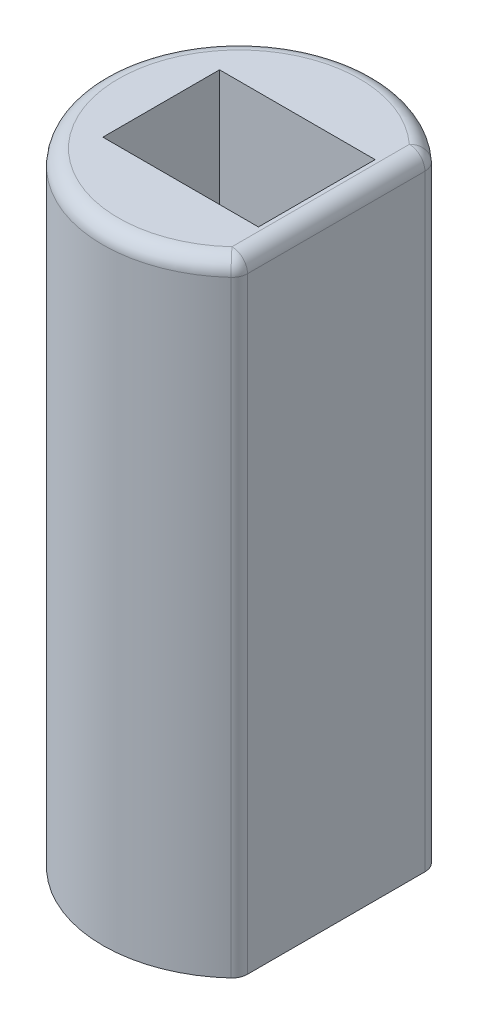
ISO-10303-21;
HEADER;
FILE_DESCRIPTION(('STEP AP214'),'2;1');
FILE_NAME('part.step','',(''),(''),'','','');
FILE_SCHEMA(('AUTOMOTIVE_DESIGN { 1 0 10303 214 1 1 1 1 }'));
ENDSEC;
DATA;
#1=APPLICATION_CONTEXT('core data for automotive mechanical design processes');
#2=APPLICATION_PROTOCOL_DEFINITION('international standard','automotive_design',2000,#1);
#3=PRODUCT_CONTEXT('',#1,'mechanical');
#4=PRODUCT('Part','Part','',(#3));
#5=PRODUCT_RELATED_PRODUCT_CATEGORY('part','',(#4));
#6=PRODUCT_DEFINITION_FORMATION('','',#4);
#7=PRODUCT_DEFINITION_CONTEXT('part definition',#1,'design');
#8=PRODUCT_DEFINITION('design','',#6,#7);
#9=PRODUCT_DEFINITION_SHAPE('','',#8);
#10=(LENGTH_UNIT() NAMED_UNIT(*) SI_UNIT(.MILLI.,.METRE.));
#11=(NAMED_UNIT(*) PLANE_ANGLE_UNIT() SI_UNIT($,.RADIAN.));
#12=(NAMED_UNIT(*) SI_UNIT($,.STERADIAN.) SOLID_ANGLE_UNIT());
#13=UNCERTAINTY_MEASURE_WITH_UNIT(LENGTH_MEASURE(1.E-05),#10,'distance_accuracy_value','');
#14=(GEOMETRIC_REPRESENTATION_CONTEXT(3) GLOBAL_UNCERTAINTY_ASSIGNED_CONTEXT((#13)) GLOBAL_UNIT_ASSIGNED_CONTEXT((#10,
#11,#12)) REPRESENTATION_CONTEXT('',''));
#15=CARTESIAN_POINT('',(0.,0.,0.));
#16=DIRECTION('',(0.,0.,1.));
#17=DIRECTION('',(1.,0.,0.));
#18=AXIS2_PLACEMENT_3D('',#15,#16,#17);
#19=CARTESIAN_POINT('',(12.7,101.6,0.));
#20=DIRECTION('',(-1.,0.,0.));
#21=DIRECTION('',(0.,0.,1.));
#22=AXIS2_PLACEMENT_3D('',#19,#20,#21);
#23=PLANE('',#22);
#24=DIRECTION('',(0.,-1.,0.));
#25=VECTOR('',#24,1.);
#26=CARTESIAN_POINT('',(12.7,101.6,-9.525));
#27=LINE('',#26,#25);
#28=CARTESIAN_POINT('',(12.7,101.6,-9.525));
#29=VERTEX_POINT('',#28);
#30=CARTESIAN_POINT('',(12.7,63.5,-9.525));
#31=VERTEX_POINT('',#30);
#32=EDGE_CURVE('E178',#29,#31,#27,.T.);
#33=ORIENTED_EDGE('',*,*,#32,.T.);
#34=DIRECTION('',(0.,0.,1.));
#35=VECTOR('',#34,1.);
#36=CARTESIAN_POINT('',(12.7,63.5,0.));
#37=LINE('',#36,#35);
#38=CARTESIAN_POINT('',(12.7,63.5,9.525));
#39=VERTEX_POINT('',#38);
#40=EDGE_CURVE('E157',#31,#39,#37,.T.);
#41=ORIENTED_EDGE('',*,*,#40,.T.);
#42=DIRECTION('',(0.,-1.,0.));
#43=VECTOR('',#42,1.);
#44=CARTESIAN_POINT('',(12.7,101.6,9.525));
#45=LINE('',#44,#43);
#46=CARTESIAN_POINT('',(12.7,101.6,9.525));
#47=VERTEX_POINT('',#46);
#48=EDGE_CURVE('E136',#47,#39,#45,.T.);
#49=ORIENTED_EDGE('',*,*,#48,.F.);
#50=DIRECTION('',(0.,0.,-1.));
#51=VECTOR('',#50,1.);
#52=CARTESIAN_POINT('',(12.7,101.6,0.));
#53=LINE('',#52,#51);
#54=EDGE_CURVE('E187',#47,#29,#53,.T.);
#55=ORIENTED_EDGE('',*,*,#54,.T.);
#56=EDGE_LOOP('',(#33,#41,#49,#55));
#57=FACE_BOUND('',#56,.T.);
#58=ADVANCED_FACE('F34',(#57),#23,.T.);
#59=CARTESIAN_POINT('',(-12.7,101.6,0.));
#60=DIRECTION('',(1.,0.,0.));
#61=DIRECTION('',(0.,0.,-1.));
#62=AXIS2_PLACEMENT_3D('',#59,#60,#61);
#63=PLANE('',#62);
#64=DIRECTION('',(0.,-1.,0.));
#65=VECTOR('',#64,1.);
#66=CARTESIAN_POINT('',(-12.7,101.6,9.525));
#67=LINE('',#66,#65);
#68=CARTESIAN_POINT('',(-12.7,101.6,9.525));
#69=VERTEX_POINT('',#68);
#70=CARTESIAN_POINT('',(-12.7,25.4,9.525));
#71=VERTEX_POINT('',#70);
#72=EDGE_CURVE('E170',#69,#71,#67,.T.);
#73=ORIENTED_EDGE('',*,*,#72,.T.);
#74=DIRECTION('',(0.,0.,1.));
#75=VECTOR('',#74,1.);
#76=CARTESIAN_POINT('',(-12.7,25.4,0.));
#77=LINE('',#76,#75);
#78=CARTESIAN_POINT('',(-12.7,25.4,-9.525));
#79=VERTEX_POINT('',#78);
#80=EDGE_CURVE('E197',#79,#71,#77,.T.);
#81=ORIENTED_EDGE('',*,*,#80,.F.);
#82=DIRECTION('',(0.,-1.,0.));
#83=VECTOR('',#82,1.);
#84=CARTESIAN_POINT('',(-12.7,101.6,-9.525));
#85=LINE('',#84,#83);
#86=CARTESIAN_POINT('',(-12.7,101.6,-9.525));
#87=VERTEX_POINT('',#86);
#88=EDGE_CURVE('E181',#87,#79,#85,.T.);
#89=ORIENTED_EDGE('',*,*,#88,.F.);
#90=DIRECTION('',(0.,0.,1.));
#91=VECTOR('',#90,1.);
#92=CARTESIAN_POINT('',(-12.7,101.6,0.));
#93=LINE('',#92,#91);
#94=EDGE_CURVE('E185',#87,#69,#93,.T.);
#95=ORIENTED_EDGE('',*,*,#94,.T.);
#96=EDGE_LOOP('',(#73,#81,#89,#95));
#97=FACE_BOUND('',#96,.T.);
#98=ADVANCED_FACE('F288',(#97),#63,.T.);
#99=DIRECTION('',(0.,0.,1.));
#100=VECTOR('',#99,1.);
#101=CARTESIAN_POINT('',(12.7,60.96,0.));
#102=LINE('',#101,#100);
#103=CARTESIAN_POINT('',(12.7,60.96,-9.525));
#104=VERTEX_POINT('',#103);
#105=CARTESIAN_POINT('',(12.7,60.96,9.525));
#106=VERTEX_POINT('',#105);
#107=EDGE_CURVE('E163',#104,#106,#102,.T.);
#108=ORIENTED_EDGE('',*,*,#107,.F.);
#109=CARTESIAN_POINT('',(12.7,25.4,-9.525));
#110=VERTEX_POINT('',#109);
#111=EDGE_CURVE('E177',#104,#110,#27,.T.);
#112=ORIENTED_EDGE('',*,*,#111,.T.);
#113=DIRECTION('',(0.,0.,-1.));
#114=VECTOR('',#113,1.);
#115=CARTESIAN_POINT('',(12.7,25.4,0.));
#116=LINE('',#115,#114);
#117=CARTESIAN_POINT('',(12.7,25.4,9.525));
#118=VERTEX_POINT('',#117);
#119=EDGE_CURVE('E203',#118,#110,#116,.T.);
#120=ORIENTED_EDGE('',*,*,#119,.F.);
#121=EDGE_CURVE('E172',#106,#118,#45,.T.);
#122=ORIENTED_EDGE('',*,*,#121,.F.);
#123=EDGE_LOOP('',(#108,#112,#120,#122));
#124=FACE_BOUND('',#123,.T.);
#125=ADVANCED_FACE('F291',(#124),#23,.T.);
#126=CARTESIAN_POINT('',(0.,25.4,0.));
#127=DIRECTION('',(0.,-1.,0.));
#128=DIRECTION('',(0.,0.,-1.));
#129=AXIS2_PLACEMENT_3D('',#126,#127,#128);
#130=CYLINDRICAL_SURFACE('',#129,8.73125);
#131=CARTESIAN_POINT('',(0.,25.4,0.));
#132=DIRECTION('',(0.,1.,0.));
#133=DIRECTION('',(0.,0.,1.));
#134=AXIS2_PLACEMENT_3D('',#131,#132,#133);
#135=CIRCLE('',#134,8.73125);
#136=CARTESIAN_POINT('',(0.,25.4,8.73125));
#137=VERTEX_POINT('',#136);
#138=EDGE_CURVE('E194',#137,#137,#135,.T.);
#139=ORIENTED_EDGE('',*,*,#138,.T.);
#140=EDGE_LOOP('',(#139));
#141=FACE_BOUND('',#140,.T.);
#142=CARTESIAN_POINT('',(0.,0.,0.));
#143=DIRECTION('',(0.,1.,0.));
#144=DIRECTION('',(0.,0.,1.));
#145=AXIS2_PLACEMENT_3D('',#142,#143,#144);
#146=CIRCLE('',#145,8.73125);
#147=CARTESIAN_POINT('',(0.,0.,8.73125));
#148=VERTEX_POINT('',#147);
#149=EDGE_CURVE('E190',#148,#148,#146,.T.);
#150=ORIENTED_EDGE('',*,*,#149,.F.);
#151=EDGE_LOOP('',(#150));
#152=FACE_BOUND('',#151,.T.);
#153=ADVANCED_FACE('F283',(#141,#152),#130,.F.);
#154=CARTESIAN_POINT('',(0.,25.4,0.));
#155=DIRECTION('',(0.,1.,0.));
#156=DIRECTION('',(0.,0.,1.));
#157=AXIS2_PLACEMENT_3D('',#154,#155,#156);
#158=PLANE('',#157);
#159=ORIENTED_EDGE('',*,*,#138,.F.);
#160=EDGE_LOOP('',(#159));
#161=FACE_BOUND('',#160,.T.);
#162=ORIENTED_EDGE('',*,*,#80,.T.);
#163=DIRECTION('',(1.,0.,0.));
#164=VECTOR('',#163,1.);
#165=CARTESIAN_POINT('',(0.,25.4,9.525));
#166=LINE('',#165,#164);
#167=EDGE_CURVE('E200',#71,#118,#166,.T.);
#168=ORIENTED_EDGE('',*,*,#167,.T.);
#169=ORIENTED_EDGE('',*,*,#119,.T.);
#170=DIRECTION('',(1.,0.,0.));
#171=VECTOR('',#170,1.);
#172=CARTESIAN_POINT('',(0.,25.4,-9.525));
#173=LINE('',#172,#171);
#174=EDGE_CURVE('E150',#79,#110,#173,.T.);
#175=ORIENTED_EDGE('',*,*,#174,.F.);
#176=EDGE_LOOP('',(#162,#168,#169,#175));
#177=FACE_BOUND('',#176,.T.);
#178=ADVANCED_FACE('F275',(#161,#177),#158,.T.);
#179=CARTESIAN_POINT('',(0.,0.,0.));
#180=DIRECTION('',(0.,1.,0.));
#181=DIRECTION('',(0.,0.,1.));
#182=AXIS2_PLACEMENT_3D('',#179,#180,#181);
#183=PLANE('',#182);
#184=ORIENTED_EDGE('',*,*,#149,.T.);
#185=EDGE_LOOP('',(#184));
#186=FACE_BOUND('',#185,.T.);
#187=CARTESIAN_POINT('',(0.,0.,0.));
#188=DIRECTION('',(0.,1.,0.));
#189=DIRECTION('',(0.,0.,1.));
#190=AXIS2_PLACEMENT_3D('',#187,#188,#189);
#191=CIRCLE('',#190,22.225);
#192=CARTESIAN_POINT('',(15.0556451612903,0.,-16.3486444018247));
#193=VERTEX_POINT('',#192);
#194=CARTESIAN_POINT('',(15.0556451612903,0.,16.3486444018247));
#195=VERTEX_POINT('',#194);
#196=EDGE_CURVE('E188',#193,#195,#191,.T.);
#197=ORIENTED_EDGE('',*,*,#196,.F.);
#198=CARTESIAN_POINT('',(13.335,0.,-14.4802278987591));
#199=DIRECTION('',(0.,1.,0.));
#200=DIRECTION('',(0.,0.,1.));
#201=AXIS2_PLACEMENT_3D('',#198,#199,#200);
#202=CIRCLE('',#201,2.54);
#203=CARTESIAN_POINT('',(15.875,0.,-14.4802278987591));
#204=VERTEX_POINT('',#203);
#205=EDGE_CURVE('E11',#193,#204,#202,.F.);
#206=ORIENTED_EDGE('',*,*,#205,.T.);
#207=DIRECTION('',(0.,0.,1.));
#208=VECTOR('',#207,1.);
#209=CARTESIAN_POINT('',(15.875,0.,0.));
#210=LINE('',#209,#208);
#211=CARTESIAN_POINT('',(15.875,0.,14.4802278987591));
#212=VERTEX_POINT('',#211);
#213=EDGE_CURVE('E184',#204,#212,#210,.T.);
#214=ORIENTED_EDGE('',*,*,#213,.T.);
#215=CARTESIAN_POINT('',(13.335,0.,14.4802278987591));
#216=DIRECTION('',(0.,1.,0.));
#217=DIRECTION('',(0.,0.,1.));
#218=AXIS2_PLACEMENT_3D('',#215,#216,#217);
#219=CIRCLE('',#218,2.54);
#220=EDGE_CURVE('E43',#212,#195,#219,.F.);
#221=ORIENTED_EDGE('',*,*,#220,.T.);
#222=EDGE_LOOP('',(#197,#206,#214,#221));
#223=FACE_BOUND('',#222,.T.);
#224=ADVANCED_FACE('F273',(#186,#223),#183,.F.);
#225=CARTESIAN_POINT('',(15.875,101.6,0.));
#226=DIRECTION('',(1.,0.,0.));
#227=DIRECTION('',(0.,0.,-1.));
#228=AXIS2_PLACEMENT_3D('',#225,#226,#227);
#229=PLANE('',#228);
#230=ORIENTED_EDGE('',*,*,#213,.F.);
#231=DIRECTION('',(0.,1.,0.));
#232=VECTOR('',#231,1.);
#233=CARTESIAN_POINT('',(15.875,101.6,-14.4802278987591));
#234=LINE('',#233,#232);
#235=CARTESIAN_POINT('',(15.875,99.06,-14.4802278987591));
#236=VERTEX_POINT('',#235);
#237=EDGE_CURVE('E216',#204,#236,#234,.T.);
#238=ORIENTED_EDGE('',*,*,#237,.T.);
#239=DIRECTION('',(0.,0.,1.));
#240=VECTOR('',#239,1.);
#241=CARTESIAN_POINT('',(15.875,99.06,0.));
#242=LINE('',#241,#240);
#243=CARTESIAN_POINT('',(15.875,99.06,14.4802278987591));
#244=VERTEX_POINT('',#243);
#245=EDGE_CURVE('E213',#236,#244,#242,.T.);
#246=ORIENTED_EDGE('',*,*,#245,.T.);
#247=DIRECTION('',(0.,1.,0.));
#248=VECTOR('',#247,1.);
#249=CARTESIAN_POINT('',(15.875,0.,14.4802278987591));
#250=LINE('',#249,#248);
#251=EDGE_CURVE('E211',#244,#212,#250,.F.);
#252=ORIENTED_EDGE('',*,*,#251,.T.);
#253=EDGE_LOOP('',(#230,#238,#246,#252));
#254=FACE_BOUND('',#253,.T.);
#255=ADVANCED_FACE('F266',(#254),#229,.T.);
#256=CARTESIAN_POINT('',(0.,101.6,0.));
#257=DIRECTION('',(0.,-1.,0.));
#258=DIRECTION('',(0.,0.,-1.));
#259=AXIS2_PLACEMENT_3D('',#256,#257,#258);
#260=CYLINDRICAL_SURFACE('',#259,22.225);
#261=CARTESIAN_POINT('',(0.,99.06,0.));
#262=DIRECTION('',(0.,1.,0.));
#263=DIRECTION('',(0.,0.,1.));
#264=AXIS2_PLACEMENT_3D('',#261,#262,#263);
#265=CIRCLE('',#264,22.225);
#266=CARTESIAN_POINT('',(15.0556451612903,99.06,16.3486444018247));
#267=VERTEX_POINT('',#266);
#268=CARTESIAN_POINT('',(15.0556451612903,99.06,-16.3486444018247));
#269=VERTEX_POINT('',#268);
#270=EDGE_CURVE('E51',#267,#269,#265,.F.);
#271=ORIENTED_EDGE('',*,*,#270,.T.);
#272=DIRECTION('',(0.,-1.,0.));
#273=VECTOR('',#272,1.);
#274=CARTESIAN_POINT('',(15.0556451612903,101.6,-16.3486444018247));
#275=LINE('',#274,#273);
#276=EDGE_CURVE('E225',#269,#193,#275,.T.);
#277=ORIENTED_EDGE('',*,*,#276,.T.);
#278=ORIENTED_EDGE('',*,*,#196,.T.);
#279=DIRECTION('',(0.,-1.,0.));
#280=VECTOR('',#279,1.);
#281=CARTESIAN_POINT('',(15.0556451612903,101.6,16.3486444018247));
#282=LINE('',#281,#280);
#283=EDGE_CURVE('E56',#195,#267,#282,.F.);
#284=ORIENTED_EDGE('',*,*,#283,.T.);
#285=EDGE_LOOP('',(#271,#277,#278,#284));
#286=FACE_BOUND('',#285,.T.);
#287=ADVANCED_FACE('F271',(#286),#260,.T.);
#288=CARTESIAN_POINT('',(0.,101.6,0.));
#289=DIRECTION('',(0.,1.,0.));
#290=DIRECTION('',(0.,0.,1.));
#291=AXIS2_PLACEMENT_3D('',#288,#289,#290);
#292=PLANE('',#291);
#293=CARTESIAN_POINT('',(0.,101.6,0.));
#294=DIRECTION('',(0.,1.,0.));
#295=DIRECTION('',(0.,0.,1.));
#296=AXIS2_PLACEMENT_3D('',#293,#294,#295);
#297=CIRCLE('',#296,19.685);
#298=CARTESIAN_POINT('',(13.335,101.6,-14.4802278987591));
#299=VERTEX_POINT('',#298);
#300=CARTESIAN_POINT('',(13.335,101.6,14.4802278987591));
#301=VERTEX_POINT('',#300);
#302=EDGE_CURVE('E218',#299,#301,#297,.T.);
#303=ORIENTED_EDGE('',*,*,#302,.T.);
#304=DIRECTION('',(0.,0.,1.));
#305=VECTOR('',#304,1.);
#306=CARTESIAN_POINT('',(13.335,101.6,0.));
#307=LINE('',#306,#305);
#308=EDGE_CURVE('E220',#301,#299,#307,.F.);
#309=ORIENTED_EDGE('',*,*,#308,.T.);
#310=EDGE_LOOP('',(#303,#309));
#311=FACE_BOUND('',#310,.T.);
#312=DIRECTION('',(1.,0.,0.));
#313=VECTOR('',#312,1.);
#314=CARTESIAN_POINT('',(0.,101.6,9.525));
#315=LINE('',#314,#313);
#316=EDGE_CURVE('E168',#69,#47,#315,.T.);
#317=ORIENTED_EDGE('',*,*,#316,.F.);
#318=ORIENTED_EDGE('',*,*,#94,.F.);
#319=DIRECTION('',(1.,0.,0.));
#320=VECTOR('',#319,1.);
#321=CARTESIAN_POINT('',(0.,101.6,-9.525));
#322=LINE('',#321,#320);
#323=EDGE_CURVE('E174',#87,#29,#322,.T.);
#324=ORIENTED_EDGE('',*,*,#323,.T.);
#325=ORIENTED_EDGE('',*,*,#54,.F.);
#326=EDGE_LOOP('',(#317,#318,#324,#325));
#327=FACE_BOUND('',#326,.T.);
#328=ADVANCED_FACE('F252',(#311,#327),#292,.T.);
#329=CARTESIAN_POINT('',(0.,101.6,-9.525));
#330=DIRECTION('',(0.,0.,-1.));
#331=DIRECTION('',(-1.,0.,0.));
#332=AXIS2_PLACEMENT_3D('',#329,#330,#331);
#333=PLANE('',#332);
#334=ORIENTED_EDGE('',*,*,#111,.F.);
#335=DIRECTION('',(-1.,0.,0.));
#336=VECTOR('',#335,1.);
#337=CARTESIAN_POINT('',(0.,60.96,-9.525));
#338=LINE('',#337,#336);
#339=CARTESIAN_POINT('',(9.52500000000001,60.96,-9.525));
#340=VERTEX_POINT('',#339);
#341=EDGE_CURVE('E166',#104,#340,#338,.T.);
#342=ORIENTED_EDGE('',*,*,#341,.T.);
#343=DIRECTION('',(0.,1.,0.));
#344=VECTOR('',#343,1.);
#345=CARTESIAN_POINT('',(9.52500000000001,101.6,-9.525));
#346=LINE('',#345,#344);
#347=CARTESIAN_POINT('',(9.52500000000001,63.5,-9.525));
#348=VERTEX_POINT('',#347);
#349=EDGE_CURVE('E155',#340,#348,#346,.T.);
#350=ORIENTED_EDGE('',*,*,#349,.T.);
#351=DIRECTION('',(-1.,0.,0.));
#352=VECTOR('',#351,1.);
#353=CARTESIAN_POINT('',(0.,63.5,-9.525));
#354=LINE('',#353,#352);
#355=EDGE_CURVE('E154',#31,#348,#354,.T.);
#356=ORIENTED_EDGE('',*,*,#355,.F.);
#357=ORIENTED_EDGE('',*,*,#32,.F.);
#358=ORIENTED_EDGE('',*,*,#323,.F.);
#359=ORIENTED_EDGE('',*,*,#88,.T.);
#360=ORIENTED_EDGE('',*,*,#174,.T.);
#361=EDGE_LOOP('',(#334,#342,#350,#356,#357,#358,#359,#360));
#362=FACE_BOUND('',#361,.T.);
#363=ADVANCED_FACE('F309',(#362),#333,.F.);
#364=CARTESIAN_POINT('',(0.,101.6,9.525));
#365=DIRECTION('',(0.,0.,-1.));
#366=DIRECTION('',(-1.,0.,0.));
#367=AXIS2_PLACEMENT_3D('',#364,#365,#366);
#368=PLANE('',#367);
#369=DIRECTION('',(-1.,0.,0.));
#370=VECTOR('',#369,1.);
#371=CARTESIAN_POINT('',(0.,60.96,9.525));
#372=LINE('',#371,#370);
#373=CARTESIAN_POINT('',(9.52500000000001,60.96,9.525));
#374=VERTEX_POINT('',#373);
#375=EDGE_CURVE('E140',#106,#374,#372,.T.);
#376=ORIENTED_EDGE('',*,*,#375,.F.);
#377=ORIENTED_EDGE('',*,*,#121,.T.);
#378=ORIENTED_EDGE('',*,*,#167,.F.);
#379=ORIENTED_EDGE('',*,*,#72,.F.);
#380=ORIENTED_EDGE('',*,*,#316,.T.);
#381=ORIENTED_EDGE('',*,*,#48,.T.);
#382=DIRECTION('',(-1.,0.,0.));
#383=VECTOR('',#382,1.);
#384=CARTESIAN_POINT('',(0.,63.5,9.525));
#385=LINE('',#384,#383);
#386=CARTESIAN_POINT('',(9.52500000000001,63.5,9.525));
#387=VERTEX_POINT('',#386);
#388=EDGE_CURVE('E129',#39,#387,#385,.T.);
#389=ORIENTED_EDGE('',*,*,#388,.T.);
#390=DIRECTION('',(0.,1.,0.));
#391=VECTOR('',#390,1.);
#392=CARTESIAN_POINT('',(9.52500000000001,101.6,9.525));
#393=LINE('',#392,#391);
#394=EDGE_CURVE('E132',#374,#387,#393,.T.);
#395=ORIENTED_EDGE('',*,*,#394,.F.);
#396=EDGE_LOOP('',(#376,#377,#378,#379,#380,#381,#389,#395));
#397=FACE_BOUND('',#396,.T.);
#398=ADVANCED_FACE('F131',(#397),#368,.T.);
#399=CARTESIAN_POINT('',(9.52500000000001,60.96,15.5542598666732));
#400=DIRECTION('',(0.,-1.,0.));
#401=DIRECTION('',(0.,0.,-1.));
#402=AXIS2_PLACEMENT_3D('',#399,#400,#401);
#403=PLANE('',#402);
#404=ORIENTED_EDGE('',*,*,#341,.F.);
#405=ORIENTED_EDGE('',*,*,#107,.T.);
#406=ORIENTED_EDGE('',*,*,#375,.T.);
#407=DIRECTION('',(0.,0.,-1.));
#408=VECTOR('',#407,1.);
#409=CARTESIAN_POINT('',(9.52500000000001,60.96,15.5542598666732));
#410=LINE('',#409,#408);
#411=EDGE_CURVE('E149',#374,#340,#410,.T.);
#412=ORIENTED_EDGE('',*,*,#411,.T.);
#413=EDGE_LOOP('',(#404,#405,#406,#412));
#414=FACE_BOUND('',#413,.T.);
#415=ADVANCED_FACE('F310',(#414),#403,.T.);
#416=CARTESIAN_POINT('',(9.52500000000001,63.5,15.5542598666732));
#417=DIRECTION('',(0.,-1.,0.));
#418=DIRECTION('',(0.,0.,-1.));
#419=AXIS2_PLACEMENT_3D('',#416,#417,#418);
#420=PLANE('',#419);
#421=ORIENTED_EDGE('',*,*,#40,.F.);
#422=ORIENTED_EDGE('',*,*,#355,.T.);
#423=DIRECTION('',(0.,0.,-1.));
#424=VECTOR('',#423,1.);
#425=CARTESIAN_POINT('',(9.52500000000001,63.5,15.5542598666732));
#426=LINE('',#425,#424);
#427=EDGE_CURVE('E147',#387,#348,#426,.T.);
#428=ORIENTED_EDGE('',*,*,#427,.F.);
#429=ORIENTED_EDGE('',*,*,#388,.F.);
#430=EDGE_LOOP('',(#421,#422,#428,#429));
#431=FACE_BOUND('',#430,.T.);
#432=ADVANCED_FACE('F153',(#431),#420,.F.);
#433=CARTESIAN_POINT('',(9.52500000000001,0.,0.));
#434=DIRECTION('',(-1.,0.,0.));
#435=DIRECTION('',(0.,0.,1.));
#436=AXIS2_PLACEMENT_3D('',#433,#434,#435);
#437=PLANE('',#436);
#438=ORIENTED_EDGE('',*,*,#349,.F.);
#439=ORIENTED_EDGE('',*,*,#411,.F.);
#440=ORIENTED_EDGE('',*,*,#394,.T.);
#441=ORIENTED_EDGE('',*,*,#427,.T.);
#442=EDGE_LOOP('',(#438,#439,#440,#441));
#443=FACE_BOUND('',#442,.T.);
#444=ADVANCED_FACE('F146',(#443),#437,.T.);
#445=CARTESIAN_POINT('',(13.335,101.6,-14.4802278987591));
#446=DIRECTION('',(0.,-1.,0.));
#447=DIRECTION('',(0.,0.,-1.));
#448=AXIS2_PLACEMENT_3D('',#445,#446,#447);
#449=CYLINDRICAL_SURFACE('',#448,2.54);
#450=ORIENTED_EDGE('',*,*,#205,.F.);
#451=ORIENTED_EDGE('',*,*,#276,.F.);
#452=CARTESIAN_POINT('',(13.335,99.06,-14.4802278987591));
#453=DIRECTION('',(0.,1.,0.));
#454=DIRECTION('',(0.,0.,1.));
#455=AXIS2_PLACEMENT_3D('',#452,#453,#454);
#456=CIRCLE('',#455,2.54);
#457=EDGE_CURVE('E237',#236,#269,#456,.T.);
#458=ORIENTED_EDGE('',*,*,#457,.F.);
#459=ORIENTED_EDGE('',*,*,#237,.F.);
#460=EDGE_LOOP('',(#450,#451,#458,#459));
#461=FACE_BOUND('',#460,.T.);
#462=ADVANCED_FACE('F36',(#461),#449,.T.);
#463=CARTESIAN_POINT('',(13.335,101.6,14.4802278987591));
#464=DIRECTION('',(0.,-1.,0.));
#465=DIRECTION('',(0.,0.,-1.));
#466=AXIS2_PLACEMENT_3D('',#463,#464,#465);
#467=CYLINDRICAL_SURFACE('',#466,2.54);
#468=ORIENTED_EDGE('',*,*,#220,.F.);
#469=ORIENTED_EDGE('',*,*,#251,.F.);
#470=CARTESIAN_POINT('',(13.335,99.06,14.4802278987591));
#471=DIRECTION('',(0.,1.,0.));
#472=DIRECTION('',(0.,0.,1.));
#473=AXIS2_PLACEMENT_3D('',#470,#471,#472);
#474=CIRCLE('',#473,2.54);
#475=EDGE_CURVE('E235',#267,#244,#474,.T.);
#476=ORIENTED_EDGE('',*,*,#475,.F.);
#477=ORIENTED_EDGE('',*,*,#283,.F.);
#478=EDGE_LOOP('',(#468,#469,#476,#477));
#479=FACE_BOUND('',#478,.T.);
#480=ADVANCED_FACE('F263',(#479),#467,.T.);
#481=CARTESIAN_POINT('',(0.,99.06,0.));
#482=DIRECTION('',(0.,1.,0.));
#483=DIRECTION('',(0.,0.,1.));
#484=AXIS2_PLACEMENT_3D('',#481,#482,#483);
#485=TOROIDAL_SURFACE('',#484,19.685,2.54);
#486=CARTESIAN_POINT('',(13.335,99.06,-14.4802278987591));
#487=DIRECTION('',(0.735597048451057,0.,0.67741935483871));
#488=DIRECTION('',(0.67741935483871,0.,-0.735597048451057));
#489=AXIS2_PLACEMENT_3D('',#486,#487,#488);
#490=CIRCLE('',#489,2.54);
#491=EDGE_CURVE('E38',#269,#299,#490,.T.);
#492=ORIENTED_EDGE('',*,*,#491,.F.);
#493=ORIENTED_EDGE('',*,*,#270,.F.);
#494=CARTESIAN_POINT('',(13.335,99.06,14.4802278987591));
#495=DIRECTION('',(0.735597048451056,0.,-0.67741935483871));
#496=DIRECTION('',(-0.67741935483871,0.,-0.735597048451056));
#497=AXIS2_PLACEMENT_3D('',#494,#495,#496);
#498=CIRCLE('',#497,2.54);
#499=EDGE_CURVE('E232',#301,#267,#498,.T.);
#500=ORIENTED_EDGE('',*,*,#499,.F.);
#501=ORIENTED_EDGE('',*,*,#302,.F.);
#502=EDGE_LOOP('',(#492,#493,#500,#501));
#503=FACE_BOUND('',#502,.T.);
#504=ADVANCED_FACE('F249',(#503),#485,.T.);
#505=CARTESIAN_POINT('',(13.335,99.06,-14.4802278987591));
#506=DIRECTION('',(0.,0.,1.));
#507=DIRECTION('',(1.,0.,0.));
#508=AXIS2_PLACEMENT_3D('',#505,#506,#507);
#509=SPHERICAL_SURFACE('',#508,2.54);
#510=ORIENTED_EDGE('',*,*,#457,.T.);
#511=ORIENTED_EDGE('',*,*,#491,.T.);
#512=CARTESIAN_POINT('',(13.335,99.06,-14.4802278987591));
#513=DIRECTION('',(0.,0.,-1.));
#514=DIRECTION('',(-1.,0.,0.));
#515=AXIS2_PLACEMENT_3D('',#512,#513,#514);
#516=CIRCLE('',#515,2.54);
#517=EDGE_CURVE('E230',#236,#299,#516,.F.);
#518=ORIENTED_EDGE('',*,*,#517,.F.);
#519=EDGE_LOOP('',(#510,#511,#518));
#520=FACE_BOUND('',#519,.T.);
#521=ADVANCED_FACE('F245',(#520),#509,.T.);
#522=CARTESIAN_POINT('',(13.335,99.06,14.4802278987591));
#523=DIRECTION('',(0.,0.,1.));
#524=DIRECTION('',(1.,0.,0.));
#525=AXIS2_PLACEMENT_3D('',#522,#523,#524);
#526=SPHERICAL_SURFACE('',#525,2.54);
#527=ORIENTED_EDGE('',*,*,#499,.T.);
#528=ORIENTED_EDGE('',*,*,#475,.T.);
#529=CARTESIAN_POINT('',(13.335,99.06,14.4802278987591));
#530=DIRECTION('',(0.,0.,1.));
#531=DIRECTION('',(1.,0.,0.));
#532=AXIS2_PLACEMENT_3D('',#529,#530,#531);
#533=CIRCLE('',#532,2.54);
#534=EDGE_CURVE('E228',#301,#244,#533,.F.);
#535=ORIENTED_EDGE('',*,*,#534,.F.);
#536=EDGE_LOOP('',(#527,#528,#535));
#537=FACE_BOUND('',#536,.T.);
#538=ADVANCED_FACE('F258',(#537),#526,.T.);
#539=CARTESIAN_POINT('',(13.335,99.06,0.));
#540=DIRECTION('',(0.,0.,1.));
#541=DIRECTION('',(1.,0.,0.));
#542=AXIS2_PLACEMENT_3D('',#539,#540,#541);
#543=CYLINDRICAL_SURFACE('',#542,2.54);
#544=ORIENTED_EDGE('',*,*,#517,.T.);
#545=ORIENTED_EDGE('',*,*,#308,.F.);
#546=ORIENTED_EDGE('',*,*,#534,.T.);
#547=ORIENTED_EDGE('',*,*,#245,.F.);
#548=EDGE_LOOP('',(#544,#545,#546,#547));
#549=FACE_BOUND('',#548,.T.);
#550=ADVANCED_FACE('F256',(#549),#543,.T.);
#551=CLOSED_SHELL('',(#58,#98,#125,#153,#178,#224,#255,#287,#328,#363,#398,#415,#432,#444,#462,
#480,#504,#521,#538,#550));
#552=MANIFOLD_SOLID_BREP('B2',#551);
#553=ADVANCED_BREP_SHAPE_REPRESENTATION('',(#18,#552),#14);
#554=SHAPE_DEFINITION_REPRESENTATION(#9,#553);
ENDSEC;
END-ISO-10303-21;
